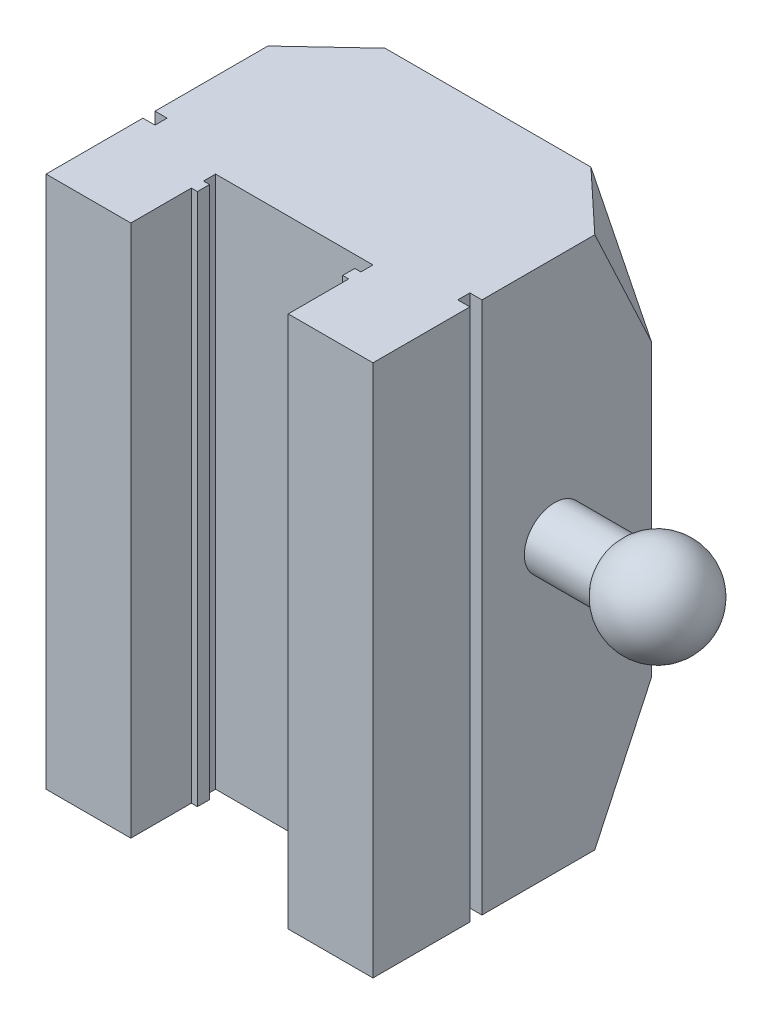
ISO-10303-21;
HEADER;
FILE_DESCRIPTION(('STEP AP214'),'2;1');
FILE_NAME('part.step','',(''),(''),'','','');
FILE_SCHEMA(('AUTOMOTIVE_DESIGN { 1 0 10303 214 1 1 1 1 }'));
ENDSEC;
DATA;
#1=APPLICATION_CONTEXT('core data for automotive mechanical design processes');
#2=APPLICATION_PROTOCOL_DEFINITION('international standard','automotive_design',2000,#1);
#3=PRODUCT_CONTEXT('',#1,'mechanical');
#4=PRODUCT('Part','Part','',(#3));
#5=PRODUCT_RELATED_PRODUCT_CATEGORY('part','',(#4));
#6=PRODUCT_DEFINITION_FORMATION('','',#4);
#7=PRODUCT_DEFINITION_CONTEXT('part definition',#1,'design');
#8=PRODUCT_DEFINITION('design','',#6,#7);
#9=PRODUCT_DEFINITION_SHAPE('','',#8);
#10=(LENGTH_UNIT() NAMED_UNIT(*) SI_UNIT(.MILLI.,.METRE.));
#11=(NAMED_UNIT(*) PLANE_ANGLE_UNIT() SI_UNIT($,.RADIAN.));
#12=(NAMED_UNIT(*) SI_UNIT($,.STERADIAN.) SOLID_ANGLE_UNIT());
#13=UNCERTAINTY_MEASURE_WITH_UNIT(LENGTH_MEASURE(1.E-05),#10,'distance_accuracy_value','');
#14=(GEOMETRIC_REPRESENTATION_CONTEXT(3) GLOBAL_UNCERTAINTY_ASSIGNED_CONTEXT((#13)) GLOBAL_UNIT_ASSIGNED_CONTEXT((#10,
#11,#12)) REPRESENTATION_CONTEXT('',''));
#15=CARTESIAN_POINT('',(0.,0.,0.));
#16=DIRECTION('',(0.,0.,1.));
#17=DIRECTION('',(1.,0.,0.));
#18=AXIS2_PLACEMENT_3D('',#15,#16,#17);
#19=CARTESIAN_POINT('',(13.5,44.,-9.));
#20=DIRECTION('',(-1.,0.,0.));
#21=DIRECTION('',(0.,0.,1.));
#22=AXIS2_PLACEMENT_3D('',#19,#20,#21);
#23=PLANE('',#22);
#24=DIRECTION('',(0.,0.905647289841975,-0.424031822392949));
#25=VECTOR('',#24,1.);
#26=CARTESIAN_POINT('',(13.5,-5.12544451862556,-15.9181372531294));
#27=LINE('',#26,#25);
#28=CARTESIAN_POINT('',(13.5,0.,-18.3179143011962));
#29=VERTEX_POINT('',#28);
#30=CARTESIAN_POINT('',(13.5,10.,-23.));
#31=VERTEX_POINT('',#30);
#32=EDGE_CURVE('E58',#29,#31,#27,.T.);
#33=ORIENTED_EDGE('',*,*,#32,.T.);
#34=DIRECTION('',(0.,-1.,0.));
#35=VECTOR('',#34,1.);
#36=CARTESIAN_POINT('',(13.5,44.,-23.));
#37=LINE('',#36,#35);
#38=CARTESIAN_POINT('',(13.5,34.,-23.));
#39=VERTEX_POINT('',#38);
#40=EDGE_CURVE('E241',#39,#31,#37,.T.);
#41=ORIENTED_EDGE('',*,*,#40,.F.);
#42=DIRECTION('',(0.,-0.905647289841975,-0.424031822392949));
#43=VECTOR('',#42,1.);
#44=CARTESIAN_POINT('',(13.5,49.1254445186256,-15.9181372531294));
#45=LINE('',#44,#43);
#46=CARTESIAN_POINT('',(13.5,44.,-18.3179143011963));
#47=VERTEX_POINT('',#46);
#48=EDGE_CURVE('E477',#47,#39,#45,.T.);
#49=ORIENTED_EDGE('',*,*,#48,.F.);
#50=DIRECTION('',(0.,0.,-1.));
#51=VECTOR('',#50,1.);
#52=CARTESIAN_POINT('',(13.5,44.,-9.));
#53=LINE('',#52,#51);
#54=CARTESIAN_POINT('',(13.5,44.,-9.));
#55=VERTEX_POINT('',#54);
#56=EDGE_CURVE('E498',#55,#47,#53,.T.);
#57=ORIENTED_EDGE('',*,*,#56,.F.);
#58=DIRECTION('',(0.,-1.,0.));
#59=VECTOR('',#58,1.);
#60=CARTESIAN_POINT('',(13.5,44.,-9.));
#61=LINE('',#60,#59);
#62=CARTESIAN_POINT('',(13.5,0.,-9.));
#63=VERTEX_POINT('',#62);
#64=EDGE_CURVE('E245',#55,#63,#61,.T.);
#65=ORIENTED_EDGE('',*,*,#64,.T.);
#66=DIRECTION('',(0.,0.,-1.));
#67=VECTOR('',#66,1.);
#68=CARTESIAN_POINT('',(13.5,0.,-9.));
#69=LINE('',#68,#67);
#70=EDGE_CURVE('E339',#63,#29,#69,.T.);
#71=ORIENTED_EDGE('',*,*,#70,.T.);
#72=EDGE_LOOP('',(#33,#41,#49,#57,#65,#71));
#73=FACE_BOUND('',#72,.T.);
#74=CARTESIAN_POINT('',(13.5,24.,-15.));
#75=DIRECTION('',(-1.,0.,0.));
#76=DIRECTION('',(0.,0.,1.));
#77=AXIS2_PLACEMENT_3D('',#74,#75,#76);
#78=CIRCLE('',#77,2.5);
#79=CARTESIAN_POINT('',(13.5,24.,-12.5));
#80=VERTEX_POINT('',#79);
#81=EDGE_CURVE('E11',#80,#80,#78,.F.);
#82=ORIENTED_EDGE('',*,*,#81,.F.);
#83=EDGE_LOOP('',(#82));
#84=FACE_BOUND('',#83,.T.);
#85=ADVANCED_FACE('F33',(#73,#84),#23,.F.);
#86=CARTESIAN_POINT('',(-13.5,44.,-9.));
#87=DIRECTION('',(1.,0.,0.));
#88=DIRECTION('',(0.,0.,-1.));
#89=AXIS2_PLACEMENT_3D('',#86,#87,#88);
#90=PLANE('',#89);
#91=DIRECTION('',(0.,-1.,0.));
#92=VECTOR('',#91,1.);
#93=CARTESIAN_POINT('',(-13.5,44.,-23.));
#94=LINE('',#93,#92);
#95=CARTESIAN_POINT('',(-13.5,34.,-23.));
#96=VERTEX_POINT('',#95);
#97=CARTESIAN_POINT('',(-13.5,10.,-23.));
#98=VERTEX_POINT('',#97);
#99=EDGE_CURVE('E230',#96,#98,#94,.T.);
#100=ORIENTED_EDGE('',*,*,#99,.T.);
#101=DIRECTION('',(0.,0.905647289841975,-0.424031822392949));
#102=VECTOR('',#101,1.);
#103=CARTESIAN_POINT('',(-13.5,-5.12544451862556,-15.9181372531294));
#104=LINE('',#103,#102);
#105=CARTESIAN_POINT('',(-13.5,0.,-18.3179143011962));
#106=VERTEX_POINT('',#105);
#107=EDGE_CURVE('E217',#106,#98,#104,.T.);
#108=ORIENTED_EDGE('',*,*,#107,.F.);
#109=DIRECTION('',(0.,0.,1.));
#110=VECTOR('',#109,1.);
#111=CARTESIAN_POINT('',(-13.5,0.,-9.));
#112=LINE('',#111,#110);
#113=CARTESIAN_POINT('',(-13.5,0.,-9.));
#114=VERTEX_POINT('',#113);
#115=EDGE_CURVE('E343',#106,#114,#112,.T.);
#116=ORIENTED_EDGE('',*,*,#115,.T.);
#117=DIRECTION('',(0.,-1.,0.));
#118=VECTOR('',#117,1.);
#119=CARTESIAN_POINT('',(-13.5,44.,-9.));
#120=LINE('',#119,#118);
#121=CARTESIAN_POINT('',(-13.5,44.,-9.));
#122=VERTEX_POINT('',#121);
#123=EDGE_CURVE('E242',#122,#114,#120,.T.);
#124=ORIENTED_EDGE('',*,*,#123,.F.);
#125=DIRECTION('',(0.,0.,1.));
#126=VECTOR('',#125,1.);
#127=CARTESIAN_POINT('',(-13.5,44.,-9.));
#128=LINE('',#127,#126);
#129=CARTESIAN_POINT('',(-13.5,44.,-18.3179143011963));
#130=VERTEX_POINT('',#129);
#131=EDGE_CURVE('E502',#130,#122,#128,.T.);
#132=ORIENTED_EDGE('',*,*,#131,.F.);
#133=DIRECTION('',(0.,-0.905647289841975,-0.424031822392949));
#134=VECTOR('',#133,1.);
#135=CARTESIAN_POINT('',(-13.5,49.1254445186256,-15.9181372531294));
#136=LINE('',#135,#134);
#137=EDGE_CURVE('E240',#130,#96,#136,.T.);
#138=ORIENTED_EDGE('',*,*,#137,.T.);
#139=EDGE_LOOP('',(#100,#108,#116,#124,#132,#138));
#140=FACE_BOUND('',#139,.T.);
#141=CARTESIAN_POINT('',(-13.5,24.,-15.));
#142=DIRECTION('',(1.,0.,0.));
#143=DIRECTION('',(0.,0.,-1.));
#144=AXIS2_PLACEMENT_3D('',#141,#142,#143);
#145=CIRCLE('',#144,2.5);
#146=CARTESIAN_POINT('',(-13.5,24.,-17.5));
#147=VERTEX_POINT('',#146);
#148=EDGE_CURVE('E42',#147,#147,#145,.F.);
#149=ORIENTED_EDGE('',*,*,#148,.F.);
#150=EDGE_LOOP('',(#149));
#151=FACE_BOUND('',#150,.T.);
#152=ADVANCED_FACE('F237',(#140,#151),#90,.F.);
#153=CARTESIAN_POINT('',(13.5,44.,-23.));
#154=DIRECTION('',(0.,0.,1.));
#155=DIRECTION('',(1.,0.,0.));
#156=AXIS2_PLACEMENT_3D('',#153,#154,#155);
#157=PLANE('',#156);
#158=DIRECTION('',(-1.,0.,0.));
#159=VECTOR('',#158,1.);
#160=CARTESIAN_POINT('',(13.5,0.,-23.));
#161=LINE('',#160,#159);
#162=CARTESIAN_POINT('',(8.5,0.,-23.));
#163=VERTEX_POINT('',#162);
#164=CARTESIAN_POINT('',(-8.5,0.,-23.));
#165=VERTEX_POINT('',#164);
#166=EDGE_CURVE('E233',#163,#165,#161,.T.);
#167=ORIENTED_EDGE('',*,*,#166,.T.);
#168=DIRECTION('',(0.447213595499958,-0.894427190999916,0.));
#169=VECTOR('',#168,1.);
#170=CARTESIAN_POINT('',(-8.5,0.,-23.));
#171=LINE('',#170,#169);
#172=EDGE_CURVE('E220',#98,#165,#171,.T.);
#173=ORIENTED_EDGE('',*,*,#172,.F.);
#174=ORIENTED_EDGE('',*,*,#99,.F.);
#175=DIRECTION('',(0.447213595499958,0.894427190999916,0.));
#176=VECTOR('',#175,1.);
#177=CARTESIAN_POINT('',(-8.5,44.,-23.));
#178=LINE('',#177,#176);
#179=CARTESIAN_POINT('',(-8.5,44.,-23.));
#180=VERTEX_POINT('',#179);
#181=EDGE_CURVE('E512',#96,#180,#178,.T.);
#182=ORIENTED_EDGE('',*,*,#181,.T.);
#183=DIRECTION('',(-1.,0.,0.));
#184=VECTOR('',#183,1.);
#185=CARTESIAN_POINT('',(13.5,44.,-23.));
#186=LINE('',#185,#184);
#187=CARTESIAN_POINT('',(8.50000000000001,44.,-23.));
#188=VERTEX_POINT('',#187);
#189=EDGE_CURVE('E500',#188,#180,#186,.T.);
#190=ORIENTED_EDGE('',*,*,#189,.F.);
#191=DIRECTION('',(-0.447213595499958,0.894427190999916,0.));
#192=VECTOR('',#191,1.);
#193=CARTESIAN_POINT('',(8.5,44.,-23.));
#194=LINE('',#193,#192);
#195=EDGE_CURVE('E482',#39,#188,#194,.T.);
#196=ORIENTED_EDGE('',*,*,#195,.F.);
#197=ORIENTED_EDGE('',*,*,#40,.T.);
#198=DIRECTION('',(-0.447213595499958,-0.894427190999916,0.));
#199=VECTOR('',#198,1.);
#200=CARTESIAN_POINT('',(8.5,0.,-23.));
#201=LINE('',#200,#199);
#202=EDGE_CURVE('E507',#31,#163,#201,.T.);
#203=ORIENTED_EDGE('',*,*,#202,.T.);
#204=EDGE_LOOP('',(#167,#173,#174,#182,#190,#196,#197,#203));
#205=FACE_BOUND('',#204,.T.);
#206=ADVANCED_FACE('F228',(#205),#157,.F.);
#207=CARTESIAN_POINT('',(0.,0.,0.));
#208=DIRECTION('',(0.,1.,0.));
#209=DIRECTION('',(0.,0.,1.));
#210=AXIS2_PLACEMENT_3D('',#207,#208,#209);
#211=PLANE('',#210);
#212=ORIENTED_EDGE('',*,*,#115,.F.);
#213=DIRECTION('',(0.72993146809726,0.,-0.683520337577002));
#214=VECTOR('',#213,1.);
#215=CARTESIAN_POINT('',(-12.0333042319154,0.,-19.6913533572452));
#216=LINE('',#215,#214);
#217=EDGE_CURVE('E50',#106,#165,#216,.T.);
#218=ORIENTED_EDGE('',*,*,#217,.T.);
#219=ORIENTED_EDGE('',*,*,#166,.F.);
#220=DIRECTION('',(-0.72993146809726,0.,-0.683520337577002));
#221=VECTOR('',#220,1.);
#222=CARTESIAN_POINT('',(12.0333042319154,0.,-19.6913533572452));
#223=LINE('',#222,#221);
#224=EDGE_CURVE('E511',#29,#163,#223,.T.);
#225=ORIENTED_EDGE('',*,*,#224,.F.);
#226=ORIENTED_EDGE('',*,*,#70,.F.);
#227=DIRECTION('',(1.,0.,0.));
#228=VECTOR('',#227,1.);
#229=CARTESIAN_POINT('',(12.5,0.,-9.));
#230=LINE('',#229,#228);
#231=CARTESIAN_POINT('',(12.5,0.,-9.));
#232=VERTEX_POINT('',#231);
#233=EDGE_CURVE('E334',#232,#63,#230,.T.);
#234=ORIENTED_EDGE('',*,*,#233,.F.);
#235=DIRECTION('',(0.,0.,-1.));
#236=VECTOR('',#235,1.);
#237=CARTESIAN_POINT('',(12.5,0.,-8.));
#238=LINE('',#237,#236);
#239=CARTESIAN_POINT('',(12.5,0.,-8.));
#240=VERTEX_POINT('',#239);
#241=EDGE_CURVE('E332',#240,#232,#238,.T.);
#242=ORIENTED_EDGE('',*,*,#241,.F.);
#243=DIRECTION('',(-1.,0.,0.));
#244=VECTOR('',#243,1.);
#245=CARTESIAN_POINT('',(13.5,0.,-8.));
#246=LINE('',#245,#244);
#247=CARTESIAN_POINT('',(13.5,0.,-8.));
#248=VERTEX_POINT('',#247);
#249=EDGE_CURVE('E324',#248,#240,#246,.T.);
#250=ORIENTED_EDGE('',*,*,#249,.F.);
#251=DIRECTION('',(0.,0.,-1.));
#252=VECTOR('',#251,1.);
#253=CARTESIAN_POINT('',(13.5,0.,0.));
#254=LINE('',#253,#252);
#255=CARTESIAN_POINT('',(13.5,0.,0.));
#256=VERTEX_POINT('',#255);
#257=EDGE_CURVE('E317',#256,#248,#254,.T.);
#258=ORIENTED_EDGE('',*,*,#257,.F.);
#259=DIRECTION('',(1.,0.,0.));
#260=VECTOR('',#259,1.);
#261=CARTESIAN_POINT('',(6.5,0.,0.));
#262=LINE('',#261,#260);
#263=CARTESIAN_POINT('',(6.5,0.,0.));
#264=VERTEX_POINT('',#263);
#265=EDGE_CURVE('E325',#264,#256,#262,.T.);
#266=ORIENTED_EDGE('',*,*,#265,.F.);
#267=DIRECTION('',(0.,0.,1.));
#268=VECTOR('',#267,1.);
#269=CARTESIAN_POINT('',(6.5,0.,0.));
#270=LINE('',#269,#268);
#271=CARTESIAN_POINT('',(6.5,0.,-5.));
#272=VERTEX_POINT('',#271);
#273=EDGE_CURVE('E375',#272,#264,#270,.T.);
#274=ORIENTED_EDGE('',*,*,#273,.F.);
#275=DIRECTION('',(1.,0.,0.));
#276=VECTOR('',#275,1.);
#277=CARTESIAN_POINT('',(6.5,0.,-5.));
#278=LINE('',#277,#276);
#279=CARTESIAN_POINT('',(6.,0.,-5.));
#280=VERTEX_POINT('',#279);
#281=EDGE_CURVE('E373',#280,#272,#278,.T.);
#282=ORIENTED_EDGE('',*,*,#281,.F.);
#283=DIRECTION('',(0.,0.,1.));
#284=VECTOR('',#283,1.);
#285=CARTESIAN_POINT('',(6.,0.,-5.));
#286=LINE('',#285,#284);
#287=CARTESIAN_POINT('',(6.,0.,-6.));
#288=VERTEX_POINT('',#287);
#289=EDGE_CURVE('E371',#288,#280,#286,.T.);
#290=ORIENTED_EDGE('',*,*,#289,.F.);
#291=DIRECTION('',(-1.,0.,0.));
#292=VECTOR('',#291,1.);
#293=CARTESIAN_POINT('',(6.,0.,-6.));
#294=LINE('',#293,#292);
#295=CARTESIAN_POINT('',(6.5,0.,-6.));
#296=VERTEX_POINT('',#295);
#297=EDGE_CURVE('E369',#296,#288,#294,.T.);
#298=ORIENTED_EDGE('',*,*,#297,.F.);
#299=DIRECTION('',(0.,0.,1.));
#300=VECTOR('',#299,1.);
#301=CARTESIAN_POINT('',(6.5,0.,-6.));
#302=LINE('',#301,#300);
#303=CARTESIAN_POINT('',(6.5,0.,-7.));
#304=VERTEX_POINT('',#303);
#305=EDGE_CURVE('E367',#304,#296,#302,.T.);
#306=ORIENTED_EDGE('',*,*,#305,.F.);
#307=DIRECTION('',(1.,0.,0.));
#308=VECTOR('',#307,1.);
#309=CARTESIAN_POINT('',(6.5,0.,-7.));
#310=LINE('',#309,#308);
#311=CARTESIAN_POINT('',(-6.5,0.,-7.));
#312=VERTEX_POINT('',#311);
#313=EDGE_CURVE('E365',#312,#304,#310,.T.);
#314=ORIENTED_EDGE('',*,*,#313,.F.);
#315=DIRECTION('',(0.,0.,-1.));
#316=VECTOR('',#315,1.);
#317=CARTESIAN_POINT('',(-6.5,0.,-6.));
#318=LINE('',#317,#316);
#319=CARTESIAN_POINT('',(-6.5,0.,-6.));
#320=VERTEX_POINT('',#319);
#321=EDGE_CURVE('E363',#320,#312,#318,.T.);
#322=ORIENTED_EDGE('',*,*,#321,.F.);
#323=DIRECTION('',(-1.,0.,0.));
#324=VECTOR('',#323,1.);
#325=CARTESIAN_POINT('',(-6.,0.,-6.));
#326=LINE('',#325,#324);
#327=CARTESIAN_POINT('',(-6.,0.,-6.));
#328=VERTEX_POINT('',#327);
#329=EDGE_CURVE('E361',#328,#320,#326,.T.);
#330=ORIENTED_EDGE('',*,*,#329,.F.);
#331=DIRECTION('',(0.,0.,-1.));
#332=VECTOR('',#331,1.);
#333=CARTESIAN_POINT('',(-6.,0.,-5.));
#334=LINE('',#333,#332);
#335=CARTESIAN_POINT('',(-6.,0.,-5.));
#336=VERTEX_POINT('',#335);
#337=EDGE_CURVE('E359',#336,#328,#334,.T.);
#338=ORIENTED_EDGE('',*,*,#337,.F.);
#339=DIRECTION('',(1.,0.,0.));
#340=VECTOR('',#339,1.);
#341=CARTESIAN_POINT('',(-6.5,0.,-5.));
#342=LINE('',#341,#340);
#343=CARTESIAN_POINT('',(-6.5,0.,-5.));
#344=VERTEX_POINT('',#343);
#345=EDGE_CURVE('E357',#344,#336,#342,.T.);
#346=ORIENTED_EDGE('',*,*,#345,.F.);
#347=DIRECTION('',(0.,0.,-1.));
#348=VECTOR('',#347,1.);
#349=CARTESIAN_POINT('',(-6.5,0.,0.));
#350=LINE('',#349,#348);
#351=CARTESIAN_POINT('',(-6.5,0.,0.));
#352=VERTEX_POINT('',#351);
#353=EDGE_CURVE('E355',#352,#344,#350,.T.);
#354=ORIENTED_EDGE('',*,*,#353,.F.);
#355=DIRECTION('',(1.,0.,0.));
#356=VECTOR('',#355,1.);
#357=CARTESIAN_POINT('',(-13.5,0.,0.));
#358=LINE('',#357,#356);
#359=CARTESIAN_POINT('',(-13.5,0.,0.));
#360=VERTEX_POINT('',#359);
#361=EDGE_CURVE('E353',#360,#352,#358,.T.);
#362=ORIENTED_EDGE('',*,*,#361,.F.);
#363=DIRECTION('',(0.,0.,1.));
#364=VECTOR('',#363,1.);
#365=CARTESIAN_POINT('',(-13.5,0.,0.));
#366=LINE('',#365,#364);
#367=CARTESIAN_POINT('',(-13.5,0.,-8.));
#368=VERTEX_POINT('',#367);
#369=EDGE_CURVE('E351',#368,#360,#366,.T.);
#370=ORIENTED_EDGE('',*,*,#369,.F.);
#371=DIRECTION('',(-1.,0.,0.));
#372=VECTOR('',#371,1.);
#373=CARTESIAN_POINT('',(-13.5,0.,-8.));
#374=LINE('',#373,#372);
#375=CARTESIAN_POINT('',(-12.5,0.,-8.));
#376=VERTEX_POINT('',#375);
#377=EDGE_CURVE('E349',#376,#368,#374,.T.);
#378=ORIENTED_EDGE('',*,*,#377,.F.);
#379=DIRECTION('',(0.,0.,1.));
#380=VECTOR('',#379,1.);
#381=CARTESIAN_POINT('',(-12.5,0.,-8.));
#382=LINE('',#381,#380);
#383=CARTESIAN_POINT('',(-12.5,0.,-9.));
#384=VERTEX_POINT('',#383);
#385=EDGE_CURVE('E347',#384,#376,#382,.T.);
#386=ORIENTED_EDGE('',*,*,#385,.F.);
#387=DIRECTION('',(1.,0.,0.));
#388=VECTOR('',#387,1.);
#389=CARTESIAN_POINT('',(-12.5,0.,-9.));
#390=LINE('',#389,#388);
#391=EDGE_CURVE('E345',#114,#384,#390,.T.);
#392=ORIENTED_EDGE('',*,*,#391,.F.);
#393=EDGE_LOOP('',(#212,#218,#219,#225,#226,#234,#242,#250,#258,#266,#274,#282,#290,#298,#306,
#314,#322,#330,#338,#346,#354,#362,#370,#378,#386,#392));
#394=FACE_BOUND('',#393,.T.);
#395=ADVANCED_FACE('F330',(#394),#211,.F.);
#396=CARTESIAN_POINT('',(0.,44.,0.));
#397=DIRECTION('',(0.,1.,0.));
#398=DIRECTION('',(0.,0.,1.));
#399=AXIS2_PLACEMENT_3D('',#396,#397,#398);
#400=PLANE('',#399);
#401=ORIENTED_EDGE('',*,*,#189,.T.);
#402=DIRECTION('',(0.72993146809726,0.,-0.683520337577002));
#403=VECTOR('',#402,1.);
#404=CARTESIAN_POINT('',(-12.0333042319154,44.,-19.6913533572452));
#405=LINE('',#404,#403);
#406=EDGE_CURVE('E487',#130,#180,#405,.T.);
#407=ORIENTED_EDGE('',*,*,#406,.F.);
#408=ORIENTED_EDGE('',*,*,#131,.T.);
#409=DIRECTION('',(1.,0.,0.));
#410=VECTOR('',#409,1.);
#411=CARTESIAN_POINT('',(-12.5,44.,-9.));
#412=LINE('',#411,#410);
#413=CARTESIAN_POINT('',(-12.5,44.,-9.));
#414=VERTEX_POINT('',#413);
#415=EDGE_CURVE('E504',#122,#414,#412,.T.);
#416=ORIENTED_EDGE('',*,*,#415,.T.);
#417=DIRECTION('',(0.,0.,1.));
#418=VECTOR('',#417,1.);
#419=CARTESIAN_POINT('',(-12.5,44.,-8.));
#420=LINE('',#419,#418);
#421=CARTESIAN_POINT('',(-12.5,44.,-8.));
#422=VERTEX_POINT('',#421);
#423=EDGE_CURVE('E430',#414,#422,#420,.T.);
#424=ORIENTED_EDGE('',*,*,#423,.T.);
#425=DIRECTION('',(-1.,0.,0.));
#426=VECTOR('',#425,1.);
#427=CARTESIAN_POINT('',(-13.5,44.,-8.));
#428=LINE('',#427,#426);
#429=CARTESIAN_POINT('',(-13.5,44.,-8.));
#430=VERTEX_POINT('',#429);
#431=EDGE_CURVE('E449',#422,#430,#428,.T.);
#432=ORIENTED_EDGE('',*,*,#431,.T.);
#433=DIRECTION('',(0.,0.,1.));
#434=VECTOR('',#433,1.);
#435=CARTESIAN_POINT('',(-13.5,44.,0.));
#436=LINE('',#435,#434);
#437=CARTESIAN_POINT('',(-13.5,44.,0.));
#438=VERTEX_POINT('',#437);
#439=EDGE_CURVE('E445',#430,#438,#436,.T.);
#440=ORIENTED_EDGE('',*,*,#439,.T.);
#441=DIRECTION('',(1.,0.,0.));
#442=VECTOR('',#441,1.);
#443=CARTESIAN_POINT('',(-13.5,44.,0.));
#444=LINE('',#443,#442);
#445=CARTESIAN_POINT('',(-6.5,44.,0.));
#446=VERTEX_POINT('',#445);
#447=EDGE_CURVE('E448',#438,#446,#444,.T.);
#448=ORIENTED_EDGE('',*,*,#447,.T.);
#449=DIRECTION('',(0.,0.,-1.));
#450=VECTOR('',#449,1.);
#451=CARTESIAN_POINT('',(-6.5,44.,0.));
#452=LINE('',#451,#450);
#453=CARTESIAN_POINT('',(-6.5,44.,-5.));
#454=VERTEX_POINT('',#453);
#455=EDGE_CURVE('E451',#446,#454,#452,.T.);
#456=ORIENTED_EDGE('',*,*,#455,.T.);
#457=DIRECTION('',(1.,0.,0.));
#458=VECTOR('',#457,1.);
#459=CARTESIAN_POINT('',(-6.5,44.,-5.));
#460=LINE('',#459,#458);
#461=CARTESIAN_POINT('',(-6.,44.,-5.));
#462=VERTEX_POINT('',#461);
#463=EDGE_CURVE('E457',#454,#462,#460,.T.);
#464=ORIENTED_EDGE('',*,*,#463,.T.);
#465=DIRECTION('',(0.,0.,-1.));
#466=VECTOR('',#465,1.);
#467=CARTESIAN_POINT('',(-6.,44.,-5.));
#468=LINE('',#467,#466);
#469=CARTESIAN_POINT('',(-6.,44.,-6.));
#470=VERTEX_POINT('',#469);
#471=EDGE_CURVE('E459',#462,#470,#468,.T.);
#472=ORIENTED_EDGE('',*,*,#471,.T.);
#473=DIRECTION('',(-1.,0.,0.));
#474=VECTOR('',#473,1.);
#475=CARTESIAN_POINT('',(-6.,44.,-6.));
#476=LINE('',#475,#474);
#477=CARTESIAN_POINT('',(-6.5,44.,-6.));
#478=VERTEX_POINT('',#477);
#479=EDGE_CURVE('E461',#470,#478,#476,.T.);
#480=ORIENTED_EDGE('',*,*,#479,.T.);
#481=DIRECTION('',(0.,0.,-1.));
#482=VECTOR('',#481,1.);
#483=CARTESIAN_POINT('',(-6.5,44.,-6.));
#484=LINE('',#483,#482);
#485=CARTESIAN_POINT('',(-6.5,44.,-7.));
#486=VERTEX_POINT('',#485);
#487=EDGE_CURVE('E463',#478,#486,#484,.T.);
#488=ORIENTED_EDGE('',*,*,#487,.T.);
#489=DIRECTION('',(1.,0.,0.));
#490=VECTOR('',#489,1.);
#491=CARTESIAN_POINT('',(6.5,44.,-7.));
#492=LINE('',#491,#490);
#493=CARTESIAN_POINT('',(6.5,44.,-7.));
#494=VERTEX_POINT('',#493);
#495=EDGE_CURVE('E465',#486,#494,#492,.T.);
#496=ORIENTED_EDGE('',*,*,#495,.T.);
#497=DIRECTION('',(0.,0.,1.));
#498=VECTOR('',#497,1.);
#499=CARTESIAN_POINT('',(6.5,44.,-6.));
#500=LINE('',#499,#498);
#501=CARTESIAN_POINT('',(6.5,44.,-6.));
#502=VERTEX_POINT('',#501);
#503=EDGE_CURVE('E467',#494,#502,#500,.T.);
#504=ORIENTED_EDGE('',*,*,#503,.T.);
#505=DIRECTION('',(-1.,0.,0.));
#506=VECTOR('',#505,1.);
#507=CARTESIAN_POINT('',(6.,44.,-6.));
#508=LINE('',#507,#506);
#509=CARTESIAN_POINT('',(6.,44.,-6.));
#510=VERTEX_POINT('',#509);
#511=EDGE_CURVE('E469',#502,#510,#508,.T.);
#512=ORIENTED_EDGE('',*,*,#511,.T.);
#513=DIRECTION('',(0.,0.,1.));
#514=VECTOR('',#513,1.);
#515=CARTESIAN_POINT('',(6.,44.,-5.));
#516=LINE('',#515,#514);
#517=CARTESIAN_POINT('',(6.,44.,-5.));
#518=VERTEX_POINT('',#517);
#519=EDGE_CURVE('E471',#510,#518,#516,.T.);
#520=ORIENTED_EDGE('',*,*,#519,.T.);
#521=DIRECTION('',(1.,0.,0.));
#522=VECTOR('',#521,1.);
#523=CARTESIAN_POINT('',(6.5,44.,-5.));
#524=LINE('',#523,#522);
#525=CARTESIAN_POINT('',(6.5,44.,-5.));
#526=VERTEX_POINT('',#525);
#527=EDGE_CURVE('E473',#518,#526,#524,.T.);
#528=ORIENTED_EDGE('',*,*,#527,.T.);
#529=DIRECTION('',(0.,0.,1.));
#530=VECTOR('',#529,1.);
#531=CARTESIAN_POINT('',(6.5,44.,0.));
#532=LINE('',#531,#530);
#533=CARTESIAN_POINT('',(6.5,44.,0.));
#534=VERTEX_POINT('',#533);
#535=EDGE_CURVE('E382',#526,#534,#532,.T.);
#536=ORIENTED_EDGE('',*,*,#535,.T.);
#537=DIRECTION('',(1.,0.,0.));
#538=VECTOR('',#537,1.);
#539=CARTESIAN_POINT('',(6.5,44.,0.));
#540=LINE('',#539,#538);
#541=CARTESIAN_POINT('',(13.5,44.,0.));
#542=VERTEX_POINT('',#541);
#543=EDGE_CURVE('E377',#534,#542,#540,.T.);
#544=ORIENTED_EDGE('',*,*,#543,.T.);
#545=DIRECTION('',(0.,0.,-1.));
#546=VECTOR('',#545,1.);
#547=CARTESIAN_POINT('',(13.5,44.,0.));
#548=LINE('',#547,#546);
#549=CARTESIAN_POINT('',(13.5,44.,-8.));
#550=VERTEX_POINT('',#549);
#551=EDGE_CURVE('E491',#542,#550,#548,.T.);
#552=ORIENTED_EDGE('',*,*,#551,.T.);
#553=DIRECTION('',(-1.,0.,0.));
#554=VECTOR('',#553,1.);
#555=CARTESIAN_POINT('',(13.5,44.,-8.));
#556=LINE('',#555,#554);
#557=CARTESIAN_POINT('',(12.5,44.,-8.));
#558=VERTEX_POINT('',#557);
#559=EDGE_CURVE('E328',#550,#558,#556,.T.);
#560=ORIENTED_EDGE('',*,*,#559,.T.);
#561=DIRECTION('',(0.,0.,-1.));
#562=VECTOR('',#561,1.);
#563=CARTESIAN_POINT('',(12.5,44.,-8.));
#564=LINE('',#563,#562);
#565=CARTESIAN_POINT('',(12.5,44.,-9.));
#566=VERTEX_POINT('',#565);
#567=EDGE_CURVE('E494',#558,#566,#564,.T.);
#568=ORIENTED_EDGE('',*,*,#567,.T.);
#569=DIRECTION('',(1.,0.,0.));
#570=VECTOR('',#569,1.);
#571=CARTESIAN_POINT('',(12.5,44.,-9.));
#572=LINE('',#571,#570);
#573=EDGE_CURVE('E496',#566,#55,#572,.T.);
#574=ORIENTED_EDGE('',*,*,#573,.T.);
#575=ORIENTED_EDGE('',*,*,#56,.T.);
#576=DIRECTION('',(-0.72993146809726,0.,-0.683520337577002));
#577=VECTOR('',#576,1.);
#578=CARTESIAN_POINT('',(12.0333042319154,44.,-19.6913533572452));
#579=LINE('',#578,#577);
#580=EDGE_CURVE('E475',#47,#188,#579,.T.);
#581=ORIENTED_EDGE('',*,*,#580,.T.);
#582=EDGE_LOOP('',(#401,#407,#408,#416,#424,#432,#440,#448,#456,#464,#472,#480,#488,#496,#504,
#512,#520,#528,#536,#544,#552,#560,#568,#574,#575,#581));
#583=FACE_BOUND('',#582,.T.);
#584=ADVANCED_FACE('F314',(#583),#400,.T.);
#585=CARTESIAN_POINT('',(6.5,44.,0.));
#586=DIRECTION('',(0.,0.,-1.));
#587=DIRECTION('',(-1.,0.,0.));
#588=AXIS2_PLACEMENT_3D('',#585,#586,#587);
#589=PLANE('',#588);
#590=ORIENTED_EDGE('',*,*,#265,.T.);
#591=DIRECTION('',(0.,-1.,0.));
#592=VECTOR('',#591,1.);
#593=CARTESIAN_POINT('',(13.5,44.,0.));
#594=LINE('',#593,#592);
#595=EDGE_CURVE('E263',#542,#256,#594,.T.);
#596=ORIENTED_EDGE('',*,*,#595,.F.);
#597=ORIENTED_EDGE('',*,*,#543,.F.);
#598=DIRECTION('',(0.,-1.,0.));
#599=VECTOR('',#598,1.);
#600=CARTESIAN_POINT('',(6.5,44.,0.));
#601=LINE('',#600,#599);
#602=EDGE_CURVE('E378',#534,#264,#601,.T.);
#603=ORIENTED_EDGE('',*,*,#602,.T.);
#604=EDGE_LOOP('',(#590,#596,#597,#603));
#605=FACE_BOUND('',#604,.T.);
#606=ADVANCED_FACE('F35',(#605),#589,.F.);
#607=CARTESIAN_POINT('',(13.5,44.,0.));
#608=DIRECTION('',(-1.,0.,0.));
#609=DIRECTION('',(0.,0.,1.));
#610=AXIS2_PLACEMENT_3D('',#607,#608,#609);
#611=PLANE('',#610);
#612=ORIENTED_EDGE('',*,*,#257,.T.);
#613=DIRECTION('',(0.,-1.,0.));
#614=VECTOR('',#613,1.);
#615=CARTESIAN_POINT('',(13.5,44.,-8.));
#616=LINE('',#615,#614);
#617=EDGE_CURVE('E260',#550,#248,#616,.T.);
#618=ORIENTED_EDGE('',*,*,#617,.F.);
#619=ORIENTED_EDGE('',*,*,#551,.F.);
#620=ORIENTED_EDGE('',*,*,#595,.T.);
#621=EDGE_LOOP('',(#612,#618,#619,#620));
#622=FACE_BOUND('',#621,.T.);
#623=ADVANCED_FACE('F307',(#622),#611,.F.);
#624=CARTESIAN_POINT('',(13.5,44.,-8.));
#625=DIRECTION('',(0.,0.,1.));
#626=DIRECTION('',(1.,0.,0.));
#627=AXIS2_PLACEMENT_3D('',#624,#625,#626);
#628=PLANE('',#627);
#629=ORIENTED_EDGE('',*,*,#249,.T.);
#630=DIRECTION('',(0.,-1.,0.));
#631=VECTOR('',#630,1.);
#632=CARTESIAN_POINT('',(12.5,44.,-8.));
#633=LINE('',#632,#631);
#634=EDGE_CURVE('E257',#558,#240,#633,.T.);
#635=ORIENTED_EDGE('',*,*,#634,.F.);
#636=ORIENTED_EDGE('',*,*,#559,.F.);
#637=ORIENTED_EDGE('',*,*,#617,.T.);
#638=EDGE_LOOP('',(#629,#635,#636,#637));
#639=FACE_BOUND('',#638,.T.);
#640=ADVANCED_FACE('F304',(#639),#628,.F.);
#641=CARTESIAN_POINT('',(12.5,44.,-8.));
#642=DIRECTION('',(-1.,0.,0.));
#643=DIRECTION('',(0.,0.,1.));
#644=AXIS2_PLACEMENT_3D('',#641,#642,#643);
#645=PLANE('',#644);
#646=ORIENTED_EDGE('',*,*,#241,.T.);
#647=DIRECTION('',(0.,-1.,0.));
#648=VECTOR('',#647,1.);
#649=CARTESIAN_POINT('',(12.5,44.,-9.));
#650=LINE('',#649,#648);
#651=EDGE_CURVE('E254',#566,#232,#650,.T.);
#652=ORIENTED_EDGE('',*,*,#651,.F.);
#653=ORIENTED_EDGE('',*,*,#567,.F.);
#654=ORIENTED_EDGE('',*,*,#634,.T.);
#655=EDGE_LOOP('',(#646,#652,#653,#654));
#656=FACE_BOUND('',#655,.T.);
#657=ADVANCED_FACE('F300',(#656),#645,.F.);
#658=CARTESIAN_POINT('',(12.5,44.,-9.));
#659=DIRECTION('',(0.,0.,-1.));
#660=DIRECTION('',(-1.,0.,0.));
#661=AXIS2_PLACEMENT_3D('',#658,#659,#660);
#662=PLANE('',#661);
#663=ORIENTED_EDGE('',*,*,#233,.T.);
#664=ORIENTED_EDGE('',*,*,#64,.F.);
#665=ORIENTED_EDGE('',*,*,#573,.F.);
#666=ORIENTED_EDGE('',*,*,#651,.T.);
#667=EDGE_LOOP('',(#663,#664,#665,#666));
#668=FACE_BOUND('',#667,.T.);
#669=ADVANCED_FACE('F296',(#668),#662,.F.);
#670=CARTESIAN_POINT('',(-12.5,44.,-9.));
#671=DIRECTION('',(0.,0.,-1.));
#672=DIRECTION('',(-1.,0.,0.));
#673=AXIS2_PLACEMENT_3D('',#670,#671,#672);
#674=PLANE('',#673);
#675=ORIENTED_EDGE('',*,*,#391,.T.);
#676=DIRECTION('',(0.,-1.,0.));
#677=VECTOR('',#676,1.);
#678=CARTESIAN_POINT('',(-12.5,44.,-9.));
#679=LINE('',#678,#677);
#680=EDGE_CURVE('E248',#414,#384,#679,.T.);
#681=ORIENTED_EDGE('',*,*,#680,.F.);
#682=ORIENTED_EDGE('',*,*,#415,.F.);
#683=ORIENTED_EDGE('',*,*,#123,.T.);
#684=EDGE_LOOP('',(#675,#681,#682,#683));
#685=FACE_BOUND('',#684,.T.);
#686=ADVANCED_FACE('F299',(#685),#674,.F.);
#687=CARTESIAN_POINT('',(-12.5,44.,-8.));
#688=DIRECTION('',(1.,0.,0.));
#689=DIRECTION('',(0.,0.,-1.));
#690=AXIS2_PLACEMENT_3D('',#687,#688,#689);
#691=PLANE('',#690);
#692=ORIENTED_EDGE('',*,*,#385,.T.);
#693=DIRECTION('',(0.,-1.,0.));
#694=VECTOR('',#693,1.);
#695=CARTESIAN_POINT('',(-12.5,44.,-8.));
#696=LINE('',#695,#694);
#697=EDGE_CURVE('E421',#422,#376,#696,.T.);
#698=ORIENTED_EDGE('',*,*,#697,.F.);
#699=ORIENTED_EDGE('',*,*,#423,.F.);
#700=ORIENTED_EDGE('',*,*,#680,.T.);
#701=EDGE_LOOP('',(#692,#698,#699,#700));
#702=FACE_BOUND('',#701,.T.);
#703=ADVANCED_FACE('F428',(#702),#691,.F.);
#704=CARTESIAN_POINT('',(-13.5,44.,-8.));
#705=DIRECTION('',(0.,0.,1.));
#706=DIRECTION('',(1.,0.,0.));
#707=AXIS2_PLACEMENT_3D('',#704,#705,#706);
#708=PLANE('',#707);
#709=ORIENTED_EDGE('',*,*,#377,.T.);
#710=DIRECTION('',(0.,-1.,0.));
#711=VECTOR('',#710,1.);
#712=CARTESIAN_POINT('',(-13.5,44.,-8.));
#713=LINE('',#712,#711);
#714=EDGE_CURVE('E418',#430,#368,#713,.T.);
#715=ORIENTED_EDGE('',*,*,#714,.F.);
#716=ORIENTED_EDGE('',*,*,#431,.F.);
#717=ORIENTED_EDGE('',*,*,#697,.T.);
#718=EDGE_LOOP('',(#709,#715,#716,#717));
#719=FACE_BOUND('',#718,.T.);
#720=ADVANCED_FACE('F439',(#719),#708,.F.);
#721=CARTESIAN_POINT('',(-13.5,44.,0.));
#722=DIRECTION('',(1.,0.,0.));
#723=DIRECTION('',(0.,0.,-1.));
#724=AXIS2_PLACEMENT_3D('',#721,#722,#723);
#725=PLANE('',#724);
#726=ORIENTED_EDGE('',*,*,#369,.T.);
#727=DIRECTION('',(0.,-1.,0.));
#728=VECTOR('',#727,1.);
#729=CARTESIAN_POINT('',(-13.5,44.,0.));
#730=LINE('',#729,#728);
#731=EDGE_CURVE('E415',#438,#360,#730,.T.);
#732=ORIENTED_EDGE('',*,*,#731,.F.);
#733=ORIENTED_EDGE('',*,*,#439,.F.);
#734=ORIENTED_EDGE('',*,*,#714,.T.);
#735=EDGE_LOOP('',(#726,#732,#733,#734));
#736=FACE_BOUND('',#735,.T.);
#737=ADVANCED_FACE('F443',(#736),#725,.F.);
#738=CARTESIAN_POINT('',(-13.5,44.,0.));
#739=DIRECTION('',(0.,0.,-1.));
#740=DIRECTION('',(-1.,0.,0.));
#741=AXIS2_PLACEMENT_3D('',#738,#739,#740);
#742=PLANE('',#741);
#743=ORIENTED_EDGE('',*,*,#361,.T.);
#744=DIRECTION('',(0.,-1.,0.));
#745=VECTOR('',#744,1.);
#746=CARTESIAN_POINT('',(-6.5,44.,0.));
#747=LINE('',#746,#745);
#748=EDGE_CURVE('E412',#446,#352,#747,.T.);
#749=ORIENTED_EDGE('',*,*,#748,.F.);
#750=ORIENTED_EDGE('',*,*,#447,.F.);
#751=ORIENTED_EDGE('',*,*,#731,.T.);
#752=EDGE_LOOP('',(#743,#749,#750,#751));
#753=FACE_BOUND('',#752,.T.);
#754=ADVANCED_FACE('F578',(#753),#742,.F.);
#755=CARTESIAN_POINT('',(-6.5,44.,0.));
#756=DIRECTION('',(-1.,0.,0.));
#757=DIRECTION('',(0.,0.,1.));
#758=AXIS2_PLACEMENT_3D('',#755,#756,#757);
#759=PLANE('',#758);
#760=ORIENTED_EDGE('',*,*,#353,.T.);
#761=DIRECTION('',(0.,-1.,0.));
#762=VECTOR('',#761,1.);
#763=CARTESIAN_POINT('',(-6.5,44.,-5.));
#764=LINE('',#763,#762);
#765=EDGE_CURVE('E409',#454,#344,#764,.T.);
#766=ORIENTED_EDGE('',*,*,#765,.F.);
#767=ORIENTED_EDGE('',*,*,#455,.F.);
#768=ORIENTED_EDGE('',*,*,#748,.T.);
#769=EDGE_LOOP('',(#760,#766,#767,#768));
#770=FACE_BOUND('',#769,.T.);
#771=ADVANCED_FACE('F574',(#770),#759,.F.);
#772=CARTESIAN_POINT('',(-6.5,44.,-5.));
#773=DIRECTION('',(0.,0.,-1.));
#774=DIRECTION('',(-1.,0.,0.));
#775=AXIS2_PLACEMENT_3D('',#772,#773,#774);
#776=PLANE('',#775);
#777=ORIENTED_EDGE('',*,*,#345,.T.);
#778=DIRECTION('',(0.,-1.,0.));
#779=VECTOR('',#778,1.);
#780=CARTESIAN_POINT('',(-6.,44.,-5.));
#781=LINE('',#780,#779);
#782=EDGE_CURVE('E406',#462,#336,#781,.T.);
#783=ORIENTED_EDGE('',*,*,#782,.F.);
#784=ORIENTED_EDGE('',*,*,#463,.F.);
#785=ORIENTED_EDGE('',*,*,#765,.T.);
#786=EDGE_LOOP('',(#777,#783,#784,#785));
#787=FACE_BOUND('',#786,.T.);
#788=ADVANCED_FACE('F570',(#787),#776,.F.);
#789=CARTESIAN_POINT('',(-6.,44.,-5.));
#790=DIRECTION('',(-1.,0.,0.));
#791=DIRECTION('',(0.,0.,1.));
#792=AXIS2_PLACEMENT_3D('',#789,#790,#791);
#793=PLANE('',#792);
#794=ORIENTED_EDGE('',*,*,#337,.T.);
#795=DIRECTION('',(0.,-1.,0.));
#796=VECTOR('',#795,1.);
#797=CARTESIAN_POINT('',(-6.,44.,-6.));
#798=LINE('',#797,#796);
#799=EDGE_CURVE('E403',#470,#328,#798,.T.);
#800=ORIENTED_EDGE('',*,*,#799,.F.);
#801=ORIENTED_EDGE('',*,*,#471,.F.);
#802=ORIENTED_EDGE('',*,*,#782,.T.);
#803=EDGE_LOOP('',(#794,#800,#801,#802));
#804=FACE_BOUND('',#803,.T.);
#805=ADVANCED_FACE('F566',(#804),#793,.F.);
#806=CARTESIAN_POINT('',(-6.,44.,-6.));
#807=DIRECTION('',(0.,0.,1.));
#808=DIRECTION('',(1.,0.,0.));
#809=AXIS2_PLACEMENT_3D('',#806,#807,#808);
#810=PLANE('',#809);
#811=ORIENTED_EDGE('',*,*,#329,.T.);
#812=DIRECTION('',(0.,-1.,0.));
#813=VECTOR('',#812,1.);
#814=CARTESIAN_POINT('',(-6.5,44.,-6.));
#815=LINE('',#814,#813);
#816=EDGE_CURVE('E400',#478,#320,#815,.T.);
#817=ORIENTED_EDGE('',*,*,#816,.F.);
#818=ORIENTED_EDGE('',*,*,#479,.F.);
#819=ORIENTED_EDGE('',*,*,#799,.T.);
#820=EDGE_LOOP('',(#811,#817,#818,#819));
#821=FACE_BOUND('',#820,.T.);
#822=ADVANCED_FACE('F562',(#821),#810,.F.);
#823=CARTESIAN_POINT('',(-6.5,44.,-6.));
#824=DIRECTION('',(-1.,0.,0.));
#825=DIRECTION('',(0.,0.,1.));
#826=AXIS2_PLACEMENT_3D('',#823,#824,#825);
#827=PLANE('',#826);
#828=ORIENTED_EDGE('',*,*,#321,.T.);
#829=DIRECTION('',(0.,-1.,0.));
#830=VECTOR('',#829,1.);
#831=CARTESIAN_POINT('',(-6.5,44.,-7.));
#832=LINE('',#831,#830);
#833=EDGE_CURVE('E397',#486,#312,#832,.T.);
#834=ORIENTED_EDGE('',*,*,#833,.F.);
#835=ORIENTED_EDGE('',*,*,#487,.F.);
#836=ORIENTED_EDGE('',*,*,#816,.T.);
#837=EDGE_LOOP('',(#828,#834,#835,#836));
#838=FACE_BOUND('',#837,.T.);
#839=ADVANCED_FACE('F558',(#838),#827,.F.);
#840=CARTESIAN_POINT('',(6.5,44.,-7.));
#841=DIRECTION('',(0.,0.,-1.));
#842=DIRECTION('',(-1.,0.,0.));
#843=AXIS2_PLACEMENT_3D('',#840,#841,#842);
#844=PLANE('',#843);
#845=ORIENTED_EDGE('',*,*,#313,.T.);
#846=DIRECTION('',(0.,-1.,0.));
#847=VECTOR('',#846,1.);
#848=CARTESIAN_POINT('',(6.5,44.,-7.));
#849=LINE('',#848,#847);
#850=EDGE_CURVE('E394',#494,#304,#849,.T.);
#851=ORIENTED_EDGE('',*,*,#850,.F.);
#852=ORIENTED_EDGE('',*,*,#495,.F.);
#853=ORIENTED_EDGE('',*,*,#833,.T.);
#854=EDGE_LOOP('',(#845,#851,#852,#853));
#855=FACE_BOUND('',#854,.T.);
#856=ADVANCED_FACE('F554',(#855),#844,.F.);
#857=CARTESIAN_POINT('',(6.5,44.,-6.));
#858=DIRECTION('',(1.,0.,0.));
#859=DIRECTION('',(0.,0.,-1.));
#860=AXIS2_PLACEMENT_3D('',#857,#858,#859);
#861=PLANE('',#860);
#862=ORIENTED_EDGE('',*,*,#305,.T.);
#863=DIRECTION('',(0.,-1.,0.));
#864=VECTOR('',#863,1.);
#865=CARTESIAN_POINT('',(6.5,44.,-6.));
#866=LINE('',#865,#864);
#867=EDGE_CURVE('E391',#502,#296,#866,.T.);
#868=ORIENTED_EDGE('',*,*,#867,.F.);
#869=ORIENTED_EDGE('',*,*,#503,.F.);
#870=ORIENTED_EDGE('',*,*,#850,.T.);
#871=EDGE_LOOP('',(#862,#868,#869,#870));
#872=FACE_BOUND('',#871,.T.);
#873=ADVANCED_FACE('F550',(#872),#861,.F.);
#874=CARTESIAN_POINT('',(6.,44.,-6.));
#875=DIRECTION('',(0.,0.,1.));
#876=DIRECTION('',(1.,0.,0.));
#877=AXIS2_PLACEMENT_3D('',#874,#875,#876);
#878=PLANE('',#877);
#879=ORIENTED_EDGE('',*,*,#297,.T.);
#880=DIRECTION('',(0.,-1.,0.));
#881=VECTOR('',#880,1.);
#882=CARTESIAN_POINT('',(6.,44.,-6.));
#883=LINE('',#882,#881);
#884=EDGE_CURVE('E388',#510,#288,#883,.T.);
#885=ORIENTED_EDGE('',*,*,#884,.F.);
#886=ORIENTED_EDGE('',*,*,#511,.F.);
#887=ORIENTED_EDGE('',*,*,#867,.T.);
#888=EDGE_LOOP('',(#879,#885,#886,#887));
#889=FACE_BOUND('',#888,.T.);
#890=ADVANCED_FACE('F546',(#889),#878,.F.);
#891=CARTESIAN_POINT('',(6.,44.,-5.));
#892=DIRECTION('',(1.,0.,0.));
#893=DIRECTION('',(0.,0.,-1.));
#894=AXIS2_PLACEMENT_3D('',#891,#892,#893);
#895=PLANE('',#894);
#896=ORIENTED_EDGE('',*,*,#289,.T.);
#897=DIRECTION('',(0.,-1.,0.));
#898=VECTOR('',#897,1.);
#899=CARTESIAN_POINT('',(6.,44.,-5.));
#900=LINE('',#899,#898);
#901=EDGE_CURVE('E385',#518,#280,#900,.T.);
#902=ORIENTED_EDGE('',*,*,#901,.F.);
#903=ORIENTED_EDGE('',*,*,#519,.F.);
#904=ORIENTED_EDGE('',*,*,#884,.T.);
#905=EDGE_LOOP('',(#896,#902,#903,#904));
#906=FACE_BOUND('',#905,.T.);
#907=ADVANCED_FACE('F542',(#906),#895,.F.);
#908=CARTESIAN_POINT('',(6.5,44.,-5.));
#909=DIRECTION('',(0.,0.,-1.));
#910=DIRECTION('',(-1.,0.,0.));
#911=AXIS2_PLACEMENT_3D('',#908,#909,#910);
#912=PLANE('',#911);
#913=ORIENTED_EDGE('',*,*,#281,.T.);
#914=DIRECTION('',(0.,-1.,0.));
#915=VECTOR('',#914,1.);
#916=CARTESIAN_POINT('',(6.5,44.,-5.));
#917=LINE('',#916,#915);
#918=EDGE_CURVE('E381',#526,#272,#917,.T.);
#919=ORIENTED_EDGE('',*,*,#918,.F.);
#920=ORIENTED_EDGE('',*,*,#527,.F.);
#921=ORIENTED_EDGE('',*,*,#901,.T.);
#922=EDGE_LOOP('',(#913,#919,#920,#921));
#923=FACE_BOUND('',#922,.T.);
#924=ADVANCED_FACE('F538',(#923),#912,.F.);
#925=CARTESIAN_POINT('',(6.5,44.,0.));
#926=DIRECTION('',(1.,0.,0.));
#927=DIRECTION('',(0.,0.,-1.));
#928=AXIS2_PLACEMENT_3D('',#925,#926,#927);
#929=PLANE('',#928);
#930=ORIENTED_EDGE('',*,*,#273,.T.);
#931=ORIENTED_EDGE('',*,*,#602,.F.);
#932=ORIENTED_EDGE('',*,*,#535,.F.);
#933=ORIENTED_EDGE('',*,*,#918,.T.);
#934=EDGE_LOOP('',(#930,#931,#932,#933));
#935=FACE_BOUND('',#934,.T.);
#936=ADVANCED_FACE('F527',(#935),#929,.F.);
#937=CARTESIAN_POINT('',(8.5,59.1254445186256,-15.9181372531294));
#938=DIRECTION('',(-0.64679065429194,-0.32339532714597,0.690707833965097));
#939=DIRECTION('',(0.72993146809726,0.,0.683520337577002));
#940=AXIS2_PLACEMENT_3D('',#937,#938,#939);
#941=PLANE('',#940);
#942=ORIENTED_EDGE('',*,*,#48,.T.);
#943=ORIENTED_EDGE('',*,*,#195,.T.);
#944=ORIENTED_EDGE('',*,*,#580,.F.);
#945=EDGE_LOOP('',(#942,#943,#944));
#946=FACE_BOUND('',#945,.T.);
#947=ADVANCED_FACE('F520',(#946),#941,.F.);
#948=CARTESIAN_POINT('',(-8.5,59.1254445186256,-15.9181372531294));
#949=DIRECTION('',(-0.64679065429194,0.32339532714597,-0.690707833965097));
#950=DIRECTION('',(-0.72993146809726,0.,0.683520337577002));
#951=AXIS2_PLACEMENT_3D('',#948,#949,#950);
#952=PLANE('',#951);
#953=ORIENTED_EDGE('',*,*,#406,.T.);
#954=ORIENTED_EDGE('',*,*,#181,.F.);
#955=ORIENTED_EDGE('',*,*,#137,.F.);
#956=EDGE_LOOP('',(#953,#954,#955));
#957=FACE_BOUND('',#956,.T.);
#958=ADVANCED_FACE('F517',(#957),#952,.T.);
#959=CARTESIAN_POINT('',(8.5,-15.1254445186256,-15.9181372531294));
#960=DIRECTION('',(0.64679065429194,-0.32339532714597,-0.690707833965097));
#961=DIRECTION('',(-0.72993146809726,0.,-0.683520337577002));
#962=AXIS2_PLACEMENT_3D('',#959,#960,#961);
#963=PLANE('',#962);
#964=ORIENTED_EDGE('',*,*,#224,.T.);
#965=ORIENTED_EDGE('',*,*,#202,.F.);
#966=ORIENTED_EDGE('',*,*,#32,.F.);
#967=EDGE_LOOP('',(#964,#965,#966));
#968=FACE_BOUND('',#967,.T.);
#969=ADVANCED_FACE('F519',(#968),#963,.T.);
#970=CARTESIAN_POINT('',(-8.5,-15.1254445186256,-15.9181372531294));
#971=DIRECTION('',(0.64679065429194,0.32339532714597,0.690707833965097));
#972=DIRECTION('',(0.72993146809726,0.,-0.683520337577002));
#973=AXIS2_PLACEMENT_3D('',#970,#971,#972);
#974=PLANE('',#973);
#975=ORIENTED_EDGE('',*,*,#107,.T.);
#976=ORIENTED_EDGE('',*,*,#172,.T.);
#977=ORIENTED_EDGE('',*,*,#217,.F.);
#978=EDGE_LOOP('',(#975,#976,#977));
#979=FACE_BOUND('',#978,.T.);
#980=ADVANCED_FACE('F219',(#979),#974,.F.);
#981=CARTESIAN_POINT('',(22.,24.,-15.));
#982=DIRECTION('',(-1.,0.,0.));
#983=DIRECTION('',(0.,0.,1.));
#984=AXIS2_PLACEMENT_3D('',#981,#982,#983);
#985=CYLINDRICAL_SURFACE('',#984,2.5);
#986=CARTESIAN_POINT('',(-18.8775010008008,24.,-15.));
#987=DIRECTION('',(-1.,0.,0.));
#988=DIRECTION('',(0.,0.,1.));
#989=AXIS2_PLACEMENT_3D('',#986,#987,#988);
#990=CIRCLE('',#989,2.5);
#991=CARTESIAN_POINT('',(-18.8775010008008,24.,-12.5));
#992=VERTEX_POINT('',#991);
#993=EDGE_CURVE('E37',#992,#992,#990,.F.);
#994=ORIENTED_EDGE('',*,*,#993,.T.);
#995=EDGE_LOOP('',(#994));
#996=FACE_BOUND('',#995,.T.);
#997=ORIENTED_EDGE('',*,*,#148,.T.);
#998=EDGE_LOOP('',(#997));
#999=FACE_BOUND('',#998,.T.);
#1000=ADVANCED_FACE('F273',(#996,#999),#985,.T.);
#1001=CARTESIAN_POINT('',(18.8775010008008,24.,-15.));
#1002=DIRECTION('',(1.,0.,0.));
#1003=DIRECTION('',(0.,0.,-1.));
#1004=AXIS2_PLACEMENT_3D('',#1001,#1002,#1003);
#1005=CIRCLE('',#1004,2.5);
#1006=CARTESIAN_POINT('',(18.8775010008008,24.,-17.5));
#1007=VERTEX_POINT('',#1006);
#1008=EDGE_CURVE('E234',#1007,#1007,#1005,.F.);
#1009=ORIENTED_EDGE('',*,*,#1008,.T.);
#1010=EDGE_LOOP('',(#1009));
#1011=FACE_BOUND('',#1010,.T.);
#1012=ORIENTED_EDGE('',*,*,#81,.T.);
#1013=EDGE_LOOP('',(#1012));
#1014=FACE_BOUND('',#1013,.T.);
#1015=ADVANCED_FACE('F283',(#1011,#1014),#985,.T.);
#1016=CARTESIAN_POINT('',(22.,24.,-15.));
#1017=DIRECTION('',(0.,-1.,0.));
#1018=DIRECTION('',(0.,0.,1.));
#1019=AXIS2_PLACEMENT_3D('',#1016,#1017,#1018);
#1020=SPHERICAL_SURFACE('',#1019,4.);
#1021=CARTESIAN_POINT('',(22.,24.,-15.));
#1022=DIRECTION('',(1.,0.,0.));
#1023=DIRECTION('',(0.,0.,-1.));
#1024=AXIS2_PLACEMENT_3D('',#1021,#1022,#1023);
#1025=SPHERICAL_SURFACE('',#1024,4.);
#1026=ORIENTED_EDGE('',*,*,#1008,.F.);
#1027=EDGE_LOOP('',(#1026));
#1028=FACE_BOUND('',#1027,.T.);
#1029=ADVANCED_FACE('F278',(#1028),#1025,.T.);
#1030=CARTESIAN_POINT('',(-22.,24.,-15.));
#1031=DIRECTION('',(0.,-1.,0.));
#1032=DIRECTION('',(0.,0.,1.));
#1033=AXIS2_PLACEMENT_3D('',#1030,#1031,#1032);
#1034=SPHERICAL_SURFACE('',#1033,4.);
#1035=CARTESIAN_POINT('',(-22.,24.,-15.));
#1036=DIRECTION('',(-1.,0.,0.));
#1037=DIRECTION('',(0.,0.,1.));
#1038=AXIS2_PLACEMENT_3D('',#1035,#1036,#1037);
#1039=SPHERICAL_SURFACE('',#1038,4.);
#1040=ORIENTED_EDGE('',*,*,#993,.F.);
#1041=EDGE_LOOP('',(#1040));
#1042=FACE_BOUND('',#1041,.T.);
#1043=ADVANCED_FACE('F276',(#1042),#1039,.T.);
#1044=CLOSED_SHELL('',(#85,#152,#206,#395,#584,#606,#623,#640,#657,#669,#686,#703,#720,#737,
#754,#771,#788,#805,#822,#839,#856,#873,#890,#907,#924,#936,#947,#958,#969,#980,#1000,#1015,
#1029,#1043));
#1045=MANIFOLD_SOLID_BREP('B2',#1044);
#1046=ADVANCED_BREP_SHAPE_REPRESENTATION('',(#18,#1045),#14);
#1047=SHAPE_DEFINITION_REPRESENTATION(#9,#1046);
ENDSEC;
END-ISO-10303-21;
